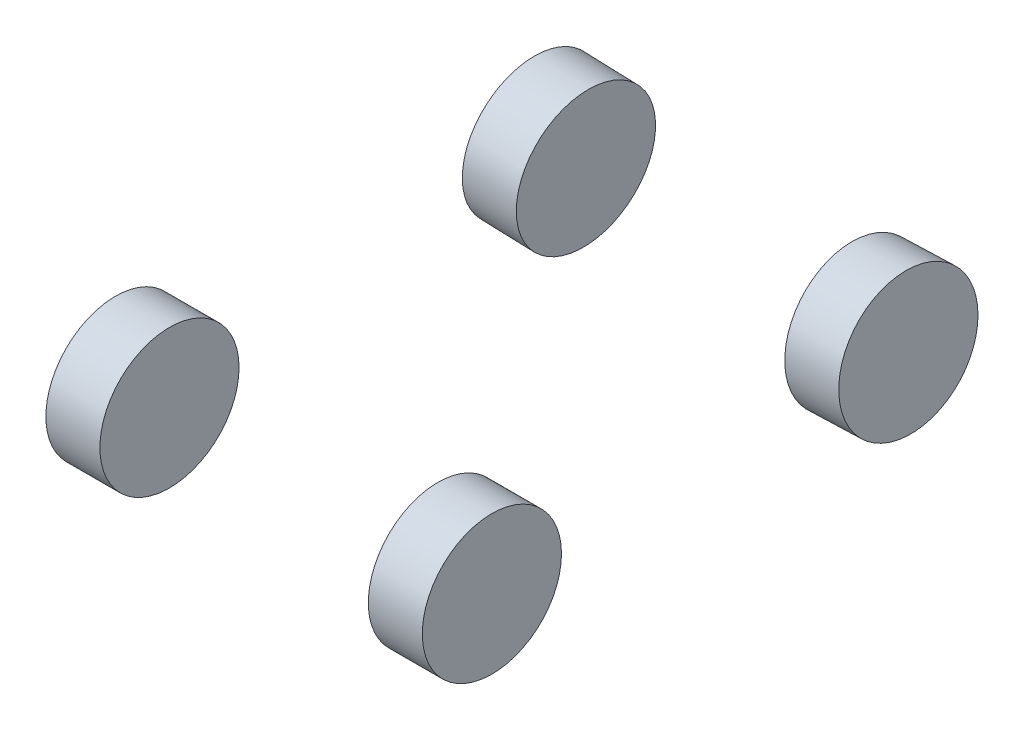
ISO-10303-21;
HEADER;
FILE_DESCRIPTION(('STEP AP214'),'2;1');
FILE_NAME('part.step','',(''),(''),'','','');
FILE_SCHEMA(('AUTOMOTIVE_DESIGN { 1 0 10303 214 1 1 1 1 }'));
ENDSEC;
DATA;
#1=APPLICATION_CONTEXT('core data for automotive mechanical design processes');
#2=APPLICATION_PROTOCOL_DEFINITION('international standard','automotive_design',2000,#1);
#3=PRODUCT_CONTEXT('',#1,'mechanical');
#4=PRODUCT('Part','Part','',(#3));
#5=PRODUCT_RELATED_PRODUCT_CATEGORY('part','',(#4));
#6=PRODUCT_DEFINITION_FORMATION('','',#4);
#7=PRODUCT_DEFINITION_CONTEXT('part definition',#1,'design');
#8=PRODUCT_DEFINITION('design','',#6,#7);
#9=PRODUCT_DEFINITION_SHAPE('','',#8);
#10=(LENGTH_UNIT() NAMED_UNIT(*) SI_UNIT(.MILLI.,.METRE.));
#11=(NAMED_UNIT(*) PLANE_ANGLE_UNIT() SI_UNIT($,.RADIAN.));
#12=(NAMED_UNIT(*) SI_UNIT($,.STERADIAN.) SOLID_ANGLE_UNIT());
#13=UNCERTAINTY_MEASURE_WITH_UNIT(LENGTH_MEASURE(1.E-05),#10,'distance_accuracy_value','');
#14=(GEOMETRIC_REPRESENTATION_CONTEXT(3) GLOBAL_UNCERTAINTY_ASSIGNED_CONTEXT((#13)) GLOBAL_UNIT_ASSIGNED_CONTEXT((#10,
#11,#12)) REPRESENTATION_CONTEXT('',''));
#15=CARTESIAN_POINT('',(0.,0.,0.));
#16=DIRECTION('',(0.,0.,1.));
#17=DIRECTION('',(1.,0.,0.));
#18=AXIS2_PLACEMENT_3D('',#15,#16,#17);
#19=CARTESIAN_POINT('',(499.499999999996,0.,-1.06305247561548E-12));
#20=DIRECTION('',(1.,0.,0.));
#21=DIRECTION('',(0.,0.,1.));
#22=AXIS2_PLACEMENT_3D('',#19,#20,#21);
#23=PLANE('',#22);
#24=CARTESIAN_POINT('',(499.5,235.000000000003,2080.));
#25=DIRECTION('',(1.,0.,0.));
#26=DIRECTION('',(0.,0.,-1.));
#27=AXIS2_PLACEMENT_3D('',#24,#25,#26);
#28=CIRCLE('',#27,259.);
#29=CARTESIAN_POINT('',(499.5,235.000000000003,1821.));
#30=VERTEX_POINT('',#29);
#31=EDGE_CURVE('E12',#30,#30,#28,.T.);
#32=ORIENTED_EDGE('',*,*,#31,.F.);
#33=EDGE_LOOP('',(#32));
#34=FACE_BOUND('',#33,.T.);
#35=ADVANCED_FACE('F74',(#34),#23,.F.);
#36=CARTESIAN_POINT('',(600.,235.000000000003,2080.));
#37=DIRECTION('',(-1.,0.,0.));
#38=DIRECTION('',(0.,0.,-1.));
#39=AXIS2_PLACEMENT_3D('',#36,#37,#38);
#40=CYLINDRICAL_SURFACE('',#39,259.);
#41=ORIENTED_EDGE('',*,*,#31,.T.);
#42=EDGE_LOOP('',(#41));
#43=FACE_BOUND('',#42,.T.);
#44=CARTESIAN_POINT('',(700.5,235.000000000003,2080.));
#45=DIRECTION('',(1.,0.,0.));
#46=DIRECTION('',(0.,0.,-1.));
#47=AXIS2_PLACEMENT_3D('',#44,#45,#46);
#48=CIRCLE('',#47,259.);
#49=CARTESIAN_POINT('',(700.5,235.000000000003,1821.));
#50=VERTEX_POINT('',#49);
#51=EDGE_CURVE('E80',#50,#50,#48,.T.);
#52=ORIENTED_EDGE('',*,*,#51,.F.);
#53=EDGE_LOOP('',(#52));
#54=FACE_BOUND('',#53,.T.);
#55=ADVANCED_FACE('F88',(#43,#54),#40,.T.);
#56=CARTESIAN_POINT('',(700.499999999996,0.,-1.43987592049937E-12));
#57=DIRECTION('',(1.,0.,0.));
#58=DIRECTION('',(0.,0.,1.));
#59=AXIS2_PLACEMENT_3D('',#56,#57,#58);
#60=PLANE('',#59);
#61=ORIENTED_EDGE('',*,*,#51,.T.);
#62=EDGE_LOOP('',(#61));
#63=FACE_BOUND('',#62,.T.);
#64=ADVANCED_FACE('F86',(#63),#60,.T.);
#65=CLOSED_SHELL('',(#35,#55,#64));
#66=MANIFOLD_SOLID_BREP('B2',#65);
#67=CARTESIAN_POINT('',(507.062180326112,17.7070015171512,0.));
#68=DIRECTION('',(0.999390827019096,0.0348994967025011,0.));
#69=DIRECTION('',(0.0348994967025011,-0.999390827019096,0.));
#70=AXIS2_PLACEMENT_3D('',#67,#68,#69);
#71=PLANE('',#70);
#72=CARTESIAN_POINT('',(499.596579583229,231.493835299442,529.999999999999));
#73=DIRECTION('',(0.999390827019096,0.0348994967025008,0.));
#74=DIRECTION('',(-0.0348994967025008,0.999390827019096,0.));
#75=AXIS2_PLACEMENT_3D('',#72,#73,#74);
#76=CIRCLE('',#75,259.);
#77=CARTESIAN_POINT('',(490.557609937281,490.336059497388,529.999999999999));
#78=VERTEX_POINT('',#77);
#79=EDGE_CURVE('E73',#78,#78,#76,.T.);
#80=ORIENTED_EDGE('',*,*,#79,.F.);
#81=EDGE_LOOP('',(#80));
#82=FACE_BOUND('',#81,.T.);
#83=ADVANCED_FACE('F123',(#82),#71,.F.);
#84=CARTESIAN_POINT('',(600.035357698648,235.001234718044,529.999999999999));
#85=DIRECTION('',(-0.999390827019096,-0.0348994967025011,0.));
#86=DIRECTION('',(-0.0348994967025011,0.999390827019096,0.));
#87=AXIS2_PLACEMENT_3D('',#84,#85,#86);
#88=CYLINDRICAL_SURFACE('',#87,259.);
#89=ORIENTED_EDGE('',*,*,#79,.T.);
#90=EDGE_LOOP('',(#89));
#91=FACE_BOUND('',#90,.T.);
#92=CARTESIAN_POINT('',(700.474135814067,238.508634136645,529.999999999999));
#93=DIRECTION('',(0.999390827019096,0.0348994967025008,0.));
#94=DIRECTION('',(-0.0348994967025008,0.999390827019096,0.));
#95=AXIS2_PLACEMENT_3D('',#92,#93,#94);
#96=CIRCLE('',#95,259.);
#97=CARTESIAN_POINT('',(691.43516616812,497.350858334591,529.999999999999));
#98=VERTEX_POINT('',#97);
#99=EDGE_CURVE('E129',#98,#98,#96,.T.);
#100=ORIENTED_EDGE('',*,*,#99,.F.);
#101=EDGE_LOOP('',(#100));
#102=FACE_BOUND('',#101,.T.);
#103=ADVANCED_FACE('F137',(#91,#102),#88,.T.);
#104=CARTESIAN_POINT('',(707.93973655695,24.7218003543539,0.));
#105=DIRECTION('',(0.999390827019096,0.0348994967025011,0.));
#106=DIRECTION('',(0.0348994967025011,-0.999390827019096,0.));
#107=AXIS2_PLACEMENT_3D('',#104,#105,#106);
#108=PLANE('',#107);
#109=ORIENTED_EDGE('',*,*,#99,.T.);
#110=EDGE_LOOP('',(#109));
#111=FACE_BOUND('',#110,.T.);
#112=ADVANCED_FACE('F135',(#111),#108,.T.);
#113=CLOSED_SHELL('',(#83,#103,#112));
#114=MANIFOLD_SOLID_BREP('B7',#113);
#115=CARTESIAN_POINT('',(-499.499999999996,0.,-1.06305247561548E-12));
#116=DIRECTION('',(-1.,0.,0.));
#117=DIRECTION('',(0.,0.,1.));
#118=AXIS2_PLACEMENT_3D('',#115,#116,#117);
#119=PLANE('',#118);
#120=CARTESIAN_POINT('',(-499.5,235.000000000003,2080.));
#121=DIRECTION('',(1.,0.,0.));
#122=DIRECTION('',(0.,0.,-1.));
#123=AXIS2_PLACEMENT_3D('',#120,#121,#122);
#124=CIRCLE('',#123,259.);
#125=CARTESIAN_POINT('',(-499.5,235.000000000003,1821.));
#126=VERTEX_POINT('',#125);
#127=EDGE_CURVE('E122',#126,#126,#124,.T.);
#128=ORIENTED_EDGE('',*,*,#127,.T.);
#129=EDGE_LOOP('',(#128));
#130=FACE_BOUND('',#129,.T.);
#131=ADVANCED_FACE('F171',(#130),#119,.F.);
#132=CARTESIAN_POINT('',(-600.,235.000000000003,2080.));
#133=DIRECTION('',(1.,0.,0.));
#134=DIRECTION('',(0.,0.,-1.));
#135=AXIS2_PLACEMENT_3D('',#132,#133,#134);
#136=CYLINDRICAL_SURFACE('',#135,259.);
#137=ORIENTED_EDGE('',*,*,#127,.F.);
#138=EDGE_LOOP('',(#137));
#139=FACE_BOUND('',#138,.T.);
#140=CARTESIAN_POINT('',(-700.5,235.000000000003,2080.));
#141=DIRECTION('',(1.,0.,0.));
#142=DIRECTION('',(0.,0.,-1.));
#143=AXIS2_PLACEMENT_3D('',#140,#141,#142);
#144=CIRCLE('',#143,259.);
#145=CARTESIAN_POINT('',(-700.5,235.000000000003,1821.));
#146=VERTEX_POINT('',#145);
#147=EDGE_CURVE('E177',#146,#146,#144,.T.);
#148=ORIENTED_EDGE('',*,*,#147,.T.);
#149=EDGE_LOOP('',(#148));
#150=FACE_BOUND('',#149,.T.);
#151=ADVANCED_FACE('F183',(#139,#150),#136,.T.);
#152=CARTESIAN_POINT('',(-700.499999999996,0.,-1.43987592049937E-12));
#153=DIRECTION('',(-1.,0.,0.));
#154=DIRECTION('',(0.,0.,1.));
#155=AXIS2_PLACEMENT_3D('',#152,#153,#154);
#156=PLANE('',#155);
#157=ORIENTED_EDGE('',*,*,#147,.F.);
#158=EDGE_LOOP('',(#157));
#159=FACE_BOUND('',#158,.T.);
#160=ADVANCED_FACE('F185',(#159),#156,.T.);
#161=CLOSED_SHELL('',(#131,#151,#160));
#162=MANIFOLD_SOLID_BREP('B68',#161);
#163=CARTESIAN_POINT('',(-507.062180326112,17.7070015171512,0.));
#164=DIRECTION('',(-0.999390827019096,0.0348994967025011,0.));
#165=DIRECTION('',(-0.0348994967025011,-0.999390827019096,0.));
#166=AXIS2_PLACEMENT_3D('',#163,#164,#165);
#167=PLANE('',#166);
#168=CARTESIAN_POINT('',(-499.596579583229,231.493835299442,529.999999999999));
#169=DIRECTION('',(0.999390827019096,-0.0348994967025008,0.));
#170=DIRECTION('',(0.0348994967025008,0.999390827019096,0.));
#171=AXIS2_PLACEMENT_3D('',#168,#169,#170);
#172=CIRCLE('',#171,259.);
#173=CARTESIAN_POINT('',(-490.557609937281,490.336059497388,529.999999999999));
#174=VERTEX_POINT('',#173);
#175=EDGE_CURVE('E170',#174,#174,#172,.T.);
#176=ORIENTED_EDGE('',*,*,#175,.T.);
#177=EDGE_LOOP('',(#176));
#178=FACE_BOUND('',#177,.T.);
#179=ADVANCED_FACE('F212',(#178),#167,.F.);
#180=CARTESIAN_POINT('',(-600.035357698648,235.001234718044,529.999999999999));
#181=DIRECTION('',(0.999390827019096,-0.0348994967025011,0.));
#182=DIRECTION('',(0.0348994967025011,0.999390827019096,0.));
#183=AXIS2_PLACEMENT_3D('',#180,#181,#182);
#184=CYLINDRICAL_SURFACE('',#183,259.);
#185=ORIENTED_EDGE('',*,*,#175,.F.);
#186=EDGE_LOOP('',(#185));
#187=FACE_BOUND('',#186,.T.);
#188=CARTESIAN_POINT('',(-700.474135814067,238.508634136645,529.999999999999));
#189=DIRECTION('',(0.999390827019096,-0.0348994967025008,0.));
#190=DIRECTION('',(0.0348994967025008,0.999390827019096,0.));
#191=AXIS2_PLACEMENT_3D('',#188,#189,#190);
#192=CIRCLE('',#191,259.);
#193=CARTESIAN_POINT('',(-691.43516616812,497.350858334591,529.999999999999));
#194=VERTEX_POINT('',#193);
#195=EDGE_CURVE('E218',#194,#194,#192,.T.);
#196=ORIENTED_EDGE('',*,*,#195,.T.);
#197=EDGE_LOOP('',(#196));
#198=FACE_BOUND('',#197,.T.);
#199=ADVANCED_FACE('F224',(#187,#198),#184,.T.);
#200=CARTESIAN_POINT('',(-707.93973655695,24.7218003543539,0.));
#201=DIRECTION('',(-0.999390827019096,0.0348994967025011,0.));
#202=DIRECTION('',(-0.0348994967025011,-0.999390827019096,0.));
#203=AXIS2_PLACEMENT_3D('',#200,#201,#202);
#204=PLANE('',#203);
#205=ORIENTED_EDGE('',*,*,#195,.F.);
#206=EDGE_LOOP('',(#205));
#207=FACE_BOUND('',#206,.T.);
#208=ADVANCED_FACE('F226',(#207),#204,.T.);
#209=CLOSED_SHELL('',(#179,#199,#208));
#210=MANIFOLD_SOLID_BREP('B117',#209);
#211=ADVANCED_BREP_SHAPE_REPRESENTATION('',(#18,#66,#114,#162,#210),#14);
#212=SHAPE_DEFINITION_REPRESENTATION(#9,#211);
ENDSEC;
END-ISO-10303-21;
